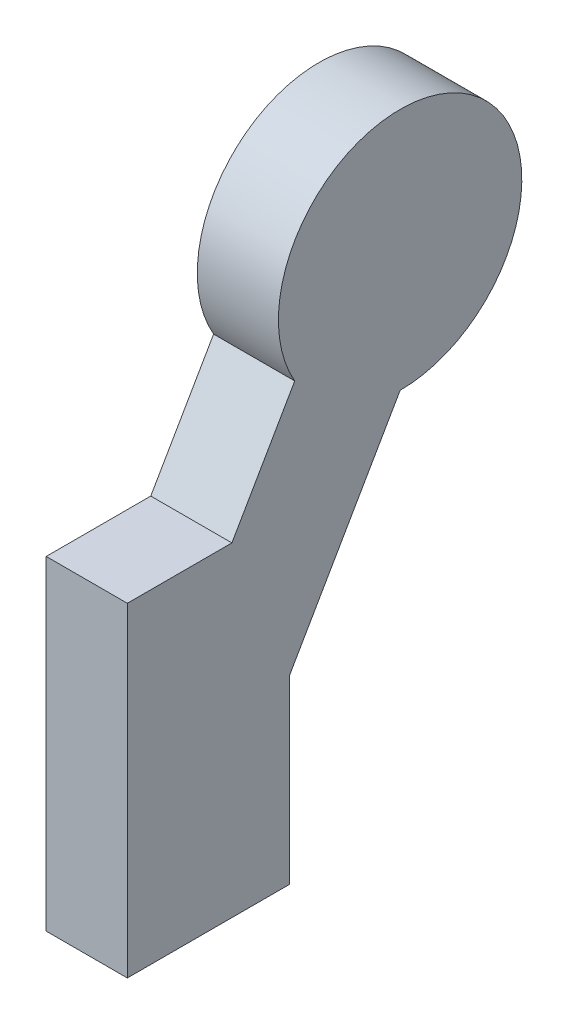
ISO-10303-21;
HEADER;
FILE_DESCRIPTION(('STEP AP214'),'2;1');
FILE_NAME('part.step','',(''),(''),'','','');
FILE_SCHEMA(('AUTOMOTIVE_DESIGN { 1 0 10303 214 1 1 1 1 }'));
ENDSEC;
DATA;
#1=APPLICATION_CONTEXT('core data for automotive mechanical design processes');
#2=APPLICATION_PROTOCOL_DEFINITION('international standard','automotive_design',2000,#1);
#3=PRODUCT_CONTEXT('',#1,'mechanical');
#4=PRODUCT('Part','Part','',(#3));
#5=PRODUCT_RELATED_PRODUCT_CATEGORY('part','',(#4));
#6=PRODUCT_DEFINITION_FORMATION('','',#4);
#7=PRODUCT_DEFINITION_CONTEXT('part definition',#1,'design');
#8=PRODUCT_DEFINITION('design','',#6,#7);
#9=PRODUCT_DEFINITION_SHAPE('','',#8);
#10=(LENGTH_UNIT() NAMED_UNIT(*) SI_UNIT(.MILLI.,.METRE.));
#11=(NAMED_UNIT(*) PLANE_ANGLE_UNIT() SI_UNIT($,.RADIAN.));
#12=(NAMED_UNIT(*) SI_UNIT($,.STERADIAN.) SOLID_ANGLE_UNIT());
#13=UNCERTAINTY_MEASURE_WITH_UNIT(LENGTH_MEASURE(1.E-05),#10,'distance_accuracy_value','');
#14=(GEOMETRIC_REPRESENTATION_CONTEXT(3) GLOBAL_UNCERTAINTY_ASSIGNED_CONTEXT((#13)) GLOBAL_UNIT_ASSIGNED_CONTEXT((#10,
#11,#12)) REPRESENTATION_CONTEXT('',''));
#15=CARTESIAN_POINT('',(0.,0.,0.));
#16=DIRECTION('',(0.,0.,1.));
#17=DIRECTION('',(1.,0.,0.));
#18=AXIS2_PLACEMENT_3D('',#15,#16,#17);
#19=CARTESIAN_POINT('',(6.35,12.7,6.35));
#20=DIRECTION('',(0.,0.,-1.));
#21=DIRECTION('',(0.,1.,0.));
#22=AXIS2_PLACEMENT_3D('',#19,#20,#21);
#23=PLANE('',#22);
#24=DIRECTION('',(0.,-1.,0.));
#25=VECTOR('',#24,1.);
#26=CARTESIAN_POINT('',(0.,12.7,6.35));
#27=LINE('',#26,#25);
#28=CARTESIAN_POINT('',(0.,12.7,6.35));
#29=VERTEX_POINT('',#28);
#30=CARTESIAN_POINT('',(0.,-12.7,6.35));
#31=VERTEX_POINT('',#30);
#32=EDGE_CURVE('E121',#29,#31,#27,.T.);
#33=ORIENTED_EDGE('',*,*,#32,.T.);
#34=DIRECTION('',(-1.,0.,0.));
#35=VECTOR('',#34,1.);
#36=CARTESIAN_POINT('',(6.35,-12.7,6.35));
#37=LINE('',#36,#35);
#38=CARTESIAN_POINT('',(6.35,-12.7,6.35));
#39=VERTEX_POINT('',#38);
#40=EDGE_CURVE('E11',#39,#31,#37,.T.);
#41=ORIENTED_EDGE('',*,*,#40,.F.);
#42=DIRECTION('',(0.,-1.,0.));
#43=VECTOR('',#42,1.);
#44=CARTESIAN_POINT('',(6.35,12.7,6.35));
#45=LINE('',#44,#43);
#46=CARTESIAN_POINT('',(6.35,12.7,6.35));
#47=VERTEX_POINT('',#46);
#48=EDGE_CURVE('E133',#47,#39,#45,.T.);
#49=ORIENTED_EDGE('',*,*,#48,.F.);
#50=DIRECTION('',(-1.,0.,0.));
#51=VECTOR('',#50,1.);
#52=CARTESIAN_POINT('',(6.35,12.7,6.35));
#53=LINE('',#52,#51);
#54=EDGE_CURVE('E117',#47,#29,#53,.T.);
#55=ORIENTED_EDGE('',*,*,#54,.T.);
#56=EDGE_LOOP('',(#33,#41,#49,#55));
#57=FACE_BOUND('',#56,.T.);
#58=ADVANCED_FACE('F31',(#57),#23,.F.);
#59=CARTESIAN_POINT('',(6.35,-12.7,6.35));
#60=DIRECTION('',(0.,1.,0.));
#61=DIRECTION('',(0.,0.,1.));
#62=AXIS2_PLACEMENT_3D('',#59,#60,#61);
#63=PLANE('',#62);
#64=DIRECTION('',(0.,0.,-1.));
#65=VECTOR('',#64,1.);
#66=CARTESIAN_POINT('',(0.,-12.7,6.35));
#67=LINE('',#66,#65);
#68=CARTESIAN_POINT('',(0.,-12.7,-6.35));
#69=VERTEX_POINT('',#68);
#70=EDGE_CURVE('E124',#31,#69,#67,.T.);
#71=ORIENTED_EDGE('',*,*,#70,.T.);
#72=DIRECTION('',(-1.,0.,0.));
#73=VECTOR('',#72,1.);
#74=CARTESIAN_POINT('',(6.35,-12.7,-6.35));
#75=LINE('',#74,#73);
#76=CARTESIAN_POINT('',(6.35,-12.7,-6.35));
#77=VERTEX_POINT('',#76);
#78=EDGE_CURVE('E39',#77,#69,#75,.T.);
#79=ORIENTED_EDGE('',*,*,#78,.F.);
#80=DIRECTION('',(0.,0.,-1.));
#81=VECTOR('',#80,1.);
#82=CARTESIAN_POINT('',(6.35,-12.7,6.35));
#83=LINE('',#82,#81);
#84=EDGE_CURVE('E87',#39,#77,#83,.T.);
#85=ORIENTED_EDGE('',*,*,#84,.F.);
#86=ORIENTED_EDGE('',*,*,#40,.T.);
#87=EDGE_LOOP('',(#71,#79,#85,#86));
#88=FACE_BOUND('',#87,.T.);
#89=ADVANCED_FACE('F158',(#88),#63,.F.);
#90=CARTESIAN_POINT('',(6.35,1.47352262806235,-6.35));
#91=DIRECTION('',(0.,0.,1.));
#92=DIRECTION('',(0.,-1.,0.));
#93=AXIS2_PLACEMENT_3D('',#90,#91,#92);
#94=PLANE('',#93);
#95=DIRECTION('',(0.,1.,0.));
#96=VECTOR('',#95,1.);
#97=CARTESIAN_POINT('',(0.,1.47352262806235,-6.35));
#98=LINE('',#97,#96);
#99=CARTESIAN_POINT('',(0.,1.47352262806235,-6.35));
#100=VERTEX_POINT('',#99);
#101=EDGE_CURVE('E126',#69,#100,#98,.T.);
#102=ORIENTED_EDGE('',*,*,#101,.T.);
#103=DIRECTION('',(-1.,0.,0.));
#104=VECTOR('',#103,1.);
#105=CARTESIAN_POINT('',(6.35,1.47352262806235,-6.35));
#106=LINE('',#105,#104);
#107=CARTESIAN_POINT('',(6.35,1.47352262806235,-6.35));
#108=VERTEX_POINT('',#107);
#109=EDGE_CURVE('E137',#108,#100,#106,.T.);
#110=ORIENTED_EDGE('',*,*,#109,.F.);
#111=DIRECTION('',(0.,1.,0.));
#112=VECTOR('',#111,1.);
#113=CARTESIAN_POINT('',(6.35,1.47352262806235,-6.35));
#114=LINE('',#113,#112);
#115=EDGE_CURVE('E145',#77,#108,#114,.T.);
#116=ORIENTED_EDGE('',*,*,#115,.F.);
#117=ORIENTED_EDGE('',*,*,#78,.T.);
#118=EDGE_LOOP('',(#102,#110,#116,#117));
#119=FACE_BOUND('',#118,.T.);
#120=ADVANCED_FACE('F143',(#119),#94,.F.);
#121=CARTESIAN_POINT('',(6.35,1.47352262806235,-6.35));
#122=DIRECTION('',(0.,0.500000000000001,0.866025403784438));
#123=DIRECTION('',(0.,-0.866025403784438,0.500000000000001));
#124=AXIS2_PLACEMENT_3D('',#121,#122,#123);
#125=PLANE('',#124);
#126=DIRECTION('',(0.,0.866025403784438,-0.500000000000001));
#127=VECTOR('',#126,1.);
#128=CARTESIAN_POINT('',(0.,1.47352262806235,-6.35));
#129=LINE('',#128,#127);
#130=CARTESIAN_POINT('',(0.,16.4557621135331,-15.));
#131=VERTEX_POINT('',#130);
#132=EDGE_CURVE('E128',#100,#131,#129,.T.);
#133=ORIENTED_EDGE('',*,*,#132,.T.);
#134=DIRECTION('',(-1.,0.,0.));
#135=VECTOR('',#134,1.);
#136=CARTESIAN_POINT('',(6.35,16.4557621135331,-15.));
#137=LINE('',#136,#135);
#138=CARTESIAN_POINT('',(6.35,16.4557621135331,-15.));
#139=VERTEX_POINT('',#138);
#140=EDGE_CURVE('E112',#139,#131,#137,.T.);
#141=ORIENTED_EDGE('',*,*,#140,.F.);
#142=DIRECTION('',(0.,0.866025403784438,-0.500000000000001));
#143=VECTOR('',#142,1.);
#144=CARTESIAN_POINT('',(6.35,1.47352262806235,-6.35));
#145=LINE('',#144,#143);
#146=EDGE_CURVE('E103',#108,#139,#145,.T.);
#147=ORIENTED_EDGE('',*,*,#146,.F.);
#148=ORIENTED_EDGE('',*,*,#109,.T.);
#149=EDGE_LOOP('',(#133,#141,#147,#148));
#150=FACE_BOUND('',#149,.T.);
#151=ADVANCED_FACE('F151',(#150),#125,.F.);
#152=CARTESIAN_POINT('',(6.35,25.9807621135331,-15.));
#153=DIRECTION('',(-1.,0.,0.));
#154=DIRECTION('',(0.,0.,1.));
#155=AXIS2_PLACEMENT_3D('',#152,#153,#154);
#156=CYLINDRICAL_SURFACE('',#155,9.525);
#157=CARTESIAN_POINT('',(0.,25.9807621135331,-15.));
#158=DIRECTION('',(1.,0.,0.));
#159=DIRECTION('',(0.,0.,-1.));
#160=AXIS2_PLACEMENT_3D('',#157,#158,#159);
#161=CIRCLE('',#160,9.525);
#162=CARTESIAN_POINT('',(0.,21.2182621135332,-6.75110802895324));
#163=VERTEX_POINT('',#162);
#164=EDGE_CURVE('E111',#131,#163,#161,.T.);
#165=ORIENTED_EDGE('',*,*,#164,.T.);
#166=DIRECTION('',(-1.,0.,0.));
#167=VECTOR('',#166,1.);
#168=CARTESIAN_POINT('',(6.35,21.2182621135332,-6.75110802895324));
#169=LINE('',#168,#167);
#170=CARTESIAN_POINT('',(6.35,21.2182621135332,-6.75110802895324));
#171=VERTEX_POINT('',#170);
#172=EDGE_CURVE('E108',#171,#163,#169,.T.);
#173=ORIENTED_EDGE('',*,*,#172,.F.);
#174=CARTESIAN_POINT('',(6.35,25.9807621135331,-15.));
#175=DIRECTION('',(1.,0.,0.));
#176=DIRECTION('',(0.,0.,-1.));
#177=AXIS2_PLACEMENT_3D('',#174,#175,#176);
#178=CIRCLE('',#177,9.525);
#179=EDGE_CURVE('E97',#139,#171,#178,.T.);
#180=ORIENTED_EDGE('',*,*,#179,.F.);
#181=ORIENTED_EDGE('',*,*,#140,.T.);
#182=EDGE_LOOP('',(#165,#173,#180,#181));
#183=FACE_BOUND('',#182,.T.);
#184=ADVANCED_FACE('F109',(#183),#156,.T.);
#185=CARTESIAN_POINT('',(6.35,21.2182621135332,-6.75110802895324));
#186=DIRECTION('',(0.,-0.500000000000001,-0.866025403784438));
#187=DIRECTION('',(0.,0.866025403784438,-0.500000000000001));
#188=AXIS2_PLACEMENT_3D('',#185,#186,#187);
#189=PLANE('',#188);
#190=DIRECTION('',(0.,-0.866025403784438,0.500000000000001));
#191=VECTOR('',#190,1.);
#192=CARTESIAN_POINT('',(0.,21.2182621135332,-6.75110802895324));
#193=LINE('',#192,#191);
#194=CARTESIAN_POINT('',(0.,12.7,-1.83308710467707));
#195=VERTEX_POINT('',#194);
#196=EDGE_CURVE('E73',#163,#195,#193,.T.);
#197=ORIENTED_EDGE('',*,*,#196,.T.);
#198=DIRECTION('',(-1.,0.,0.));
#199=VECTOR('',#198,1.);
#200=CARTESIAN_POINT('',(6.35,12.7,-1.83308710467707));
#201=LINE('',#200,#199);
#202=CARTESIAN_POINT('',(6.35,12.7,-1.83308710467707));
#203=VERTEX_POINT('',#202);
#204=EDGE_CURVE('E113',#203,#195,#201,.T.);
#205=ORIENTED_EDGE('',*,*,#204,.F.);
#206=DIRECTION('',(0.,-0.866025403784438,0.500000000000001));
#207=VECTOR('',#206,1.);
#208=CARTESIAN_POINT('',(6.35,21.2182621135332,-6.75110802895324));
#209=LINE('',#208,#207);
#210=EDGE_CURVE('E101',#171,#203,#209,.T.);
#211=ORIENTED_EDGE('',*,*,#210,.F.);
#212=ORIENTED_EDGE('',*,*,#172,.T.);
#213=EDGE_LOOP('',(#197,#205,#211,#212));
#214=FACE_BOUND('',#213,.T.);
#215=ADVANCED_FACE('F115',(#214),#189,.F.);
#216=CARTESIAN_POINT('',(6.35,12.7,6.35));
#217=DIRECTION('',(0.,-1.,0.));
#218=DIRECTION('',(0.,0.,-1.));
#219=AXIS2_PLACEMENT_3D('',#216,#217,#218);
#220=PLANE('',#219);
#221=DIRECTION('',(0.,0.,1.));
#222=VECTOR('',#221,1.);
#223=CARTESIAN_POINT('',(0.,12.7,6.35));
#224=LINE('',#223,#222);
#225=EDGE_CURVE('E79',#195,#29,#224,.T.);
#226=ORIENTED_EDGE('',*,*,#225,.T.);
#227=ORIENTED_EDGE('',*,*,#54,.F.);
#228=DIRECTION('',(0.,0.,1.));
#229=VECTOR('',#228,1.);
#230=CARTESIAN_POINT('',(6.35,12.7,6.35));
#231=LINE('',#230,#229);
#232=EDGE_CURVE('E47',#203,#47,#231,.T.);
#233=ORIENTED_EDGE('',*,*,#232,.F.);
#234=ORIENTED_EDGE('',*,*,#204,.T.);
#235=EDGE_LOOP('',(#226,#227,#233,#234));
#236=FACE_BOUND('',#235,.T.);
#237=ADVANCED_FACE('F172',(#236),#220,.F.);
#238=CARTESIAN_POINT('',(6.35,25.9807621135331,-15.));
#239=DIRECTION('',(1.,0.,0.));
#240=DIRECTION('',(0.,0.,-1.));
#241=AXIS2_PLACEMENT_3D('',#238,#239,#240);
#242=PLANE('',#241);
#243=ORIENTED_EDGE('',*,*,#48,.T.);
#244=ORIENTED_EDGE('',*,*,#84,.T.);
#245=ORIENTED_EDGE('',*,*,#115,.T.);
#246=ORIENTED_EDGE('',*,*,#146,.T.);
#247=ORIENTED_EDGE('',*,*,#179,.T.);
#248=ORIENTED_EDGE('',*,*,#210,.T.);
#249=ORIENTED_EDGE('',*,*,#232,.T.);
#250=EDGE_LOOP('',(#243,#244,#245,#246,#247,#248,#249));
#251=FACE_BOUND('',#250,.T.);
#252=ADVANCED_FACE('F99',(#251),#242,.T.);
#253=CARTESIAN_POINT('',(0.,25.9807621135331,-15.));
#254=DIRECTION('',(1.,0.,0.));
#255=DIRECTION('',(0.,0.,-1.));
#256=AXIS2_PLACEMENT_3D('',#253,#254,#255);
#257=PLANE('',#256);
#258=ORIENTED_EDGE('',*,*,#32,.F.);
#259=ORIENTED_EDGE('',*,*,#225,.F.);
#260=ORIENTED_EDGE('',*,*,#196,.F.);
#261=ORIENTED_EDGE('',*,*,#164,.F.);
#262=ORIENTED_EDGE('',*,*,#132,.F.);
#263=ORIENTED_EDGE('',*,*,#101,.F.);
#264=ORIENTED_EDGE('',*,*,#70,.F.);
#265=EDGE_LOOP('',(#258,#259,#260,#261,#262,#263,#264));
#266=FACE_BOUND('',#265,.T.);
#267=ADVANCED_FACE('F149',(#266),#257,.F.);
#268=CLOSED_SHELL('',(#58,#89,#120,#151,#184,#215,#237,#252,#267));
#269=MANIFOLD_SOLID_BREP('B2',#268);
#270=ADVANCED_BREP_SHAPE_REPRESENTATION('',(#18,#269),#14);
#271=SHAPE_DEFINITION_REPRESENTATION(#9,#270);
ENDSEC;
END-ISO-10303-21;
